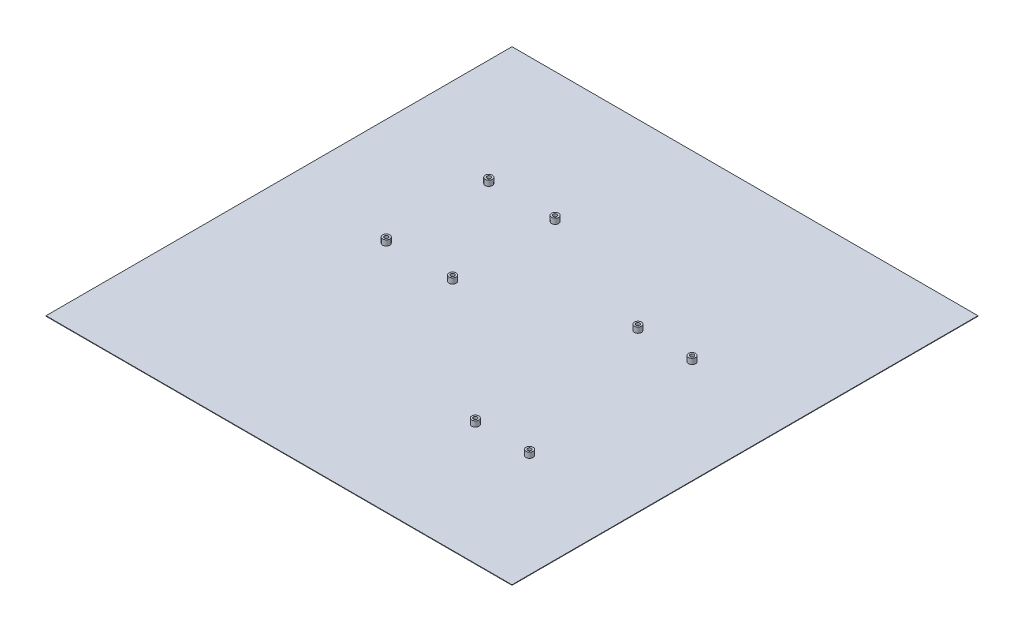
ISO-10303-21;
HEADER;
FILE_DESCRIPTION(('STEP AP214'),'2;1');
FILE_NAME('part.step','',(''),(''),'','','');
FILE_SCHEMA(('AUTOMOTIVE_DESIGN { 1 0 10303 214 1 1 1 1 }'));
ENDSEC;
DATA;
#1=APPLICATION_CONTEXT('core data for automotive mechanical design processes');
#2=APPLICATION_PROTOCOL_DEFINITION('international standard','automotive_design',2000,#1);
#3=PRODUCT_CONTEXT('',#1,'mechanical');
#4=PRODUCT('Part','Part','',(#3));
#5=PRODUCT_RELATED_PRODUCT_CATEGORY('part','',(#4));
#6=PRODUCT_DEFINITION_FORMATION('','',#4);
#7=PRODUCT_DEFINITION_CONTEXT('part definition',#1,'design');
#8=PRODUCT_DEFINITION('design','',#6,#7);
#9=PRODUCT_DEFINITION_SHAPE('','',#8);
#10=(LENGTH_UNIT() NAMED_UNIT(*) SI_UNIT(.MILLI.,.METRE.));
#11=(NAMED_UNIT(*) PLANE_ANGLE_UNIT() SI_UNIT($,.RADIAN.));
#12=(NAMED_UNIT(*) SI_UNIT($,.STERADIAN.) SOLID_ANGLE_UNIT());
#13=UNCERTAINTY_MEASURE_WITH_UNIT(LENGTH_MEASURE(1.E-05),#10,'distance_accuracy_value','');
#14=(GEOMETRIC_REPRESENTATION_CONTEXT(3) GLOBAL_UNCERTAINTY_ASSIGNED_CONTEXT((#13)) GLOBAL_UNIT_ASSIGNED_CONTEXT((#10,
#11,#12)) REPRESENTATION_CONTEXT('',''));
#15=CARTESIAN_POINT('',(0.,0.,0.));
#16=DIRECTION('',(0.,0.,1.));
#17=DIRECTION('',(1.,0.,0.));
#18=AXIS2_PLACEMENT_3D('',#15,#16,#17);
#19=CARTESIAN_POINT('',(215.,0.45,215.));
#20=DIRECTION('',(-1.,0.,0.));
#21=DIRECTION('',(0.,0.,1.));
#22=AXIS2_PLACEMENT_3D('',#19,#20,#21);
#23=PLANE('',#22);
#24=DIRECTION('',(0.,0.,-1.));
#25=VECTOR('',#24,1.);
#26=CARTESIAN_POINT('',(215.,0.,215.));
#27=LINE('',#26,#25);
#28=CARTESIAN_POINT('',(215.,0.,215.));
#29=VERTEX_POINT('',#28);
#30=CARTESIAN_POINT('',(215.,0.,-215.));
#31=VERTEX_POINT('',#30);
#32=EDGE_CURVE('E101',#29,#31,#27,.T.);
#33=ORIENTED_EDGE('',*,*,#32,.T.);
#34=DIRECTION('',(0.,-1.,0.));
#35=VECTOR('',#34,1.);
#36=CARTESIAN_POINT('',(215.,0.45,-215.));
#37=LINE('',#36,#35);
#38=CARTESIAN_POINT('',(215.,0.45,-215.));
#39=VERTEX_POINT('',#38);
#40=EDGE_CURVE('E92',#39,#31,#37,.T.);
#41=ORIENTED_EDGE('',*,*,#40,.F.);
#42=DIRECTION('',(0.,0.,-1.));
#43=VECTOR('',#42,1.);
#44=CARTESIAN_POINT('',(215.,0.45,215.));
#45=LINE('',#44,#43);
#46=CARTESIAN_POINT('',(215.,0.45,215.));
#47=VERTEX_POINT('',#46);
#48=EDGE_CURVE('E86',#47,#39,#45,.T.);
#49=ORIENTED_EDGE('',*,*,#48,.F.);
#50=DIRECTION('',(0.,-1.,0.));
#51=VECTOR('',#50,1.);
#52=CARTESIAN_POINT('',(215.,0.45,215.));
#53=LINE('',#52,#51);
#54=EDGE_CURVE('E97',#47,#29,#53,.T.);
#55=ORIENTED_EDGE('',*,*,#54,.T.);
#56=EDGE_LOOP('',(#33,#41,#49,#55));
#57=FACE_BOUND('',#56,.T.);
#58=ADVANCED_FACE('F34',(#57),#23,.F.);
#59=CARTESIAN_POINT('',(-215.,0.45,-215.));
#60=DIRECTION('',(0.,0.,1.));
#61=DIRECTION('',(1.,0.,0.));
#62=AXIS2_PLACEMENT_3D('',#59,#60,#61);
#63=PLANE('',#62);
#64=DIRECTION('',(-1.,0.,0.));
#65=VECTOR('',#64,1.);
#66=CARTESIAN_POINT('',(-215.,0.,-215.));
#67=LINE('',#66,#65);
#68=CARTESIAN_POINT('',(-215.,0.,-215.));
#69=VERTEX_POINT('',#68);
#70=EDGE_CURVE('E91',#31,#69,#67,.T.);
#71=ORIENTED_EDGE('',*,*,#70,.T.);
#72=DIRECTION('',(0.,-1.,0.));
#73=VECTOR('',#72,1.);
#74=CARTESIAN_POINT('',(-215.,0.45,-215.));
#75=LINE('',#74,#73);
#76=CARTESIAN_POINT('',(-215.,0.45,-215.));
#77=VERTEX_POINT('',#76);
#78=EDGE_CURVE('E89',#77,#69,#75,.T.);
#79=ORIENTED_EDGE('',*,*,#78,.F.);
#80=DIRECTION('',(-1.,0.,0.));
#81=VECTOR('',#80,1.);
#82=CARTESIAN_POINT('',(-215.,0.45,-215.));
#83=LINE('',#82,#81);
#84=EDGE_CURVE('E81',#39,#77,#83,.T.);
#85=ORIENTED_EDGE('',*,*,#84,.F.);
#86=ORIENTED_EDGE('',*,*,#40,.T.);
#87=EDGE_LOOP('',(#71,#79,#85,#86));
#88=FACE_BOUND('',#87,.T.);
#89=ADVANCED_FACE('F90',(#88),#63,.F.);
#90=CARTESIAN_POINT('',(-215.,0.45,215.));
#91=DIRECTION('',(1.,0.,0.));
#92=DIRECTION('',(0.,0.,-1.));
#93=AXIS2_PLACEMENT_3D('',#90,#91,#92);
#94=PLANE('',#93);
#95=DIRECTION('',(0.,0.,1.));
#96=VECTOR('',#95,1.);
#97=CARTESIAN_POINT('',(-215.,0.,215.));
#98=LINE('',#97,#96);
#99=CARTESIAN_POINT('',(-215.,0.,215.));
#100=VERTEX_POINT('',#99);
#101=EDGE_CURVE('E67',#69,#100,#98,.T.);
#102=ORIENTED_EDGE('',*,*,#101,.T.);
#103=DIRECTION('',(0.,-1.,0.));
#104=VECTOR('',#103,1.);
#105=CARTESIAN_POINT('',(-215.,0.45,215.));
#106=LINE('',#105,#104);
#107=CARTESIAN_POINT('',(-215.,0.45,215.));
#108=VERTEX_POINT('',#107);
#109=EDGE_CURVE('E93',#108,#100,#106,.T.);
#110=ORIENTED_EDGE('',*,*,#109,.F.);
#111=DIRECTION('',(0.,0.,1.));
#112=VECTOR('',#111,1.);
#113=CARTESIAN_POINT('',(-215.,0.45,215.));
#114=LINE('',#113,#112);
#115=EDGE_CURVE('E84',#77,#108,#114,.T.);
#116=ORIENTED_EDGE('',*,*,#115,.F.);
#117=ORIENTED_EDGE('',*,*,#78,.T.);
#118=EDGE_LOOP('',(#102,#110,#116,#117));
#119=FACE_BOUND('',#118,.T.);
#120=ADVANCED_FACE('F95',(#119),#94,.F.);
#121=CARTESIAN_POINT('',(-215.,0.45,215.));
#122=DIRECTION('',(0.,0.,-1.));
#123=DIRECTION('',(-1.,0.,0.));
#124=AXIS2_PLACEMENT_3D('',#121,#122,#123);
#125=PLANE('',#124);
#126=DIRECTION('',(1.,0.,0.));
#127=VECTOR('',#126,1.);
#128=CARTESIAN_POINT('',(-215.,0.,215.));
#129=LINE('',#128,#127);
#130=EDGE_CURVE('E73',#100,#29,#129,.T.);
#131=ORIENTED_EDGE('',*,*,#130,.T.);
#132=ORIENTED_EDGE('',*,*,#54,.F.);
#133=DIRECTION('',(1.,0.,0.));
#134=VECTOR('',#133,1.);
#135=CARTESIAN_POINT('',(-215.,0.45,215.));
#136=LINE('',#135,#134);
#137=EDGE_CURVE('E50',#108,#47,#136,.T.);
#138=ORIENTED_EDGE('',*,*,#137,.F.);
#139=ORIENTED_EDGE('',*,*,#109,.T.);
#140=EDGE_LOOP('',(#131,#132,#138,#139));
#141=FACE_BOUND('',#140,.T.);
#142=ADVANCED_FACE('F136',(#141),#125,.F.);
#143=CARTESIAN_POINT('',(0.,0.45,0.));
#144=DIRECTION('',(0.,-1.,0.));
#145=DIRECTION('',(0.,0.,-1.));
#146=AXIS2_PLACEMENT_3D('',#143,#144,#145);
#147=PLANE('',#146);
#148=CARTESIAN_POINT('',(69.7933457956039,0.45,103.62693864792));
#149=DIRECTION('',(0.,-1.,0.));
#150=DIRECTION('',(0.,0.,-1.));
#151=AXIS2_PLACEMENT_3D('',#148,#149,#150);
#152=CIRCLE('',#151,3.3);
#153=CARTESIAN_POINT('',(69.7933457956039,0.45,100.32693864792));
#154=VERTEX_POINT('',#153);
#155=EDGE_CURVE('E11',#154,#154,#152,.F.);
#156=ORIENTED_EDGE('',*,*,#155,.F.);
#157=EDGE_LOOP('',(#156));
#158=FACE_BOUND('',#157,.T.);
#159=CARTESIAN_POINT('',(119.793345795604,0.45,103.62693864792));
#160=DIRECTION('',(0.,-1.,0.));
#161=DIRECTION('',(0.,0.,-1.));
#162=AXIS2_PLACEMENT_3D('',#159,#160,#161);
#163=CIRCLE('',#162,3.3);
#164=CARTESIAN_POINT('',(119.793345795604,0.45,100.32693864792));
#165=VERTEX_POINT('',#164);
#166=EDGE_CURVE('E42',#165,#165,#163,.F.);
#167=ORIENTED_EDGE('',*,*,#166,.F.);
#168=EDGE_LOOP('',(#167));
#169=FACE_BOUND('',#168,.T.);
#170=CARTESIAN_POINT('',(69.7933457956034,0.45,-46.3730613520803));
#171=DIRECTION('',(0.,-1.,0.));
#172=DIRECTION('',(0.,0.,-1.));
#173=AXIS2_PLACEMENT_3D('',#170,#171,#172);
#174=CIRCLE('',#173,3.29999999999999);
#175=CARTESIAN_POINT('',(69.7933457956034,0.45,-49.6730613520803));
#176=VERTEX_POINT('',#175);
#177=EDGE_CURVE('E126',#176,#176,#174,.F.);
#178=ORIENTED_EDGE('',*,*,#177,.F.);
#179=EDGE_LOOP('',(#178));
#180=FACE_BOUND('',#179,.T.);
#181=CARTESIAN_POINT('',(119.793345795603,0.45,-46.3730613520804));
#182=DIRECTION('',(0.,-1.,0.));
#183=DIRECTION('',(0.,0.,-1.));
#184=AXIS2_PLACEMENT_3D('',#181,#182,#183);
#185=CIRCLE('',#184,3.3);
#186=CARTESIAN_POINT('',(119.793345795603,0.45,-49.6730613520804));
#187=VERTEX_POINT('',#186);
#188=EDGE_CURVE('E123',#187,#187,#185,.F.);
#189=ORIENTED_EDGE('',*,*,#188,.F.);
#190=EDGE_LOOP('',(#189));
#191=FACE_BOUND('',#190,.T.);
#192=CARTESIAN_POINT('',(-115.979958459858,0.45,0.0533736116027292));
#193=DIRECTION('',(0.,-1.,0.));
#194=DIRECTION('',(0.,0.,-1.));
#195=AXIS2_PLACEMENT_3D('',#192,#193,#194);
#196=CIRCLE('',#195,3.3);
#197=CARTESIAN_POINT('',(-115.979958459858,0.45,-3.24662638839728));
#198=VERTEX_POINT('',#197);
#199=EDGE_CURVE('E120',#198,#198,#196,.F.);
#200=ORIENTED_EDGE('',*,*,#199,.F.);
#201=EDGE_LOOP('',(#200));
#202=FACE_BOUND('',#201,.T.);
#203=CARTESIAN_POINT('',(-54.9804485661854,0.45,-0.19239606062272));
#204=DIRECTION('',(0.,-1.,0.));
#205=DIRECTION('',(0.,0.,-1.));
#206=AXIS2_PLACEMENT_3D('',#203,#204,#205);
#207=CIRCLE('',#206,3.3);
#208=CARTESIAN_POINT('',(-54.9804485661854,0.45,-3.49239606062272));
#209=VERTEX_POINT('',#208);
#210=EDGE_CURVE('E117',#209,#209,#207,.F.);
#211=ORIENTED_EDGE('',*,*,#210,.F.);
#212=EDGE_LOOP('',(#211));
#213=FACE_BOUND('',#212,.T.);
#214=CARTESIAN_POINT('',(-55.3632046349034,0.45,-95.1916381933473));
#215=DIRECTION('',(0.,-1.,0.));
#216=DIRECTION('',(0.,0.,-1.));
#217=AXIS2_PLACEMENT_3D('',#214,#215,#216);
#218=CIRCLE('',#217,3.3);
#219=CARTESIAN_POINT('',(-55.3632046349034,0.45,-98.4916381933473));
#220=VERTEX_POINT('',#219);
#221=EDGE_CURVE('E114',#220,#220,#218,.F.);
#222=ORIENTED_EDGE('',*,*,#221,.F.);
#223=EDGE_LOOP('',(#222));
#224=FACE_BOUND('',#223,.T.);
#225=CARTESIAN_POINT('',(-116.362714528576,0.45,-94.9458685211219));
#226=DIRECTION('',(0.,-1.,0.));
#227=DIRECTION('',(0.,0.,-1.));
#228=AXIS2_PLACEMENT_3D('',#225,#226,#227);
#229=CIRCLE('',#228,3.3);
#230=CARTESIAN_POINT('',(-116.362714528576,0.45,-98.2458685211218));
#231=VERTEX_POINT('',#230);
#232=EDGE_CURVE('E111',#231,#231,#229,.F.);
#233=ORIENTED_EDGE('',*,*,#232,.F.);
#234=EDGE_LOOP('',(#233));
#235=FACE_BOUND('',#234,.T.);
#236=ORIENTED_EDGE('',*,*,#48,.T.);
#237=ORIENTED_EDGE('',*,*,#84,.T.);
#238=ORIENTED_EDGE('',*,*,#115,.T.);
#239=ORIENTED_EDGE('',*,*,#137,.T.);
#240=EDGE_LOOP('',(#236,#237,#238,#239));
#241=FACE_BOUND('',#240,.T.);
#242=ADVANCED_FACE('F82',(#158,#169,#180,#191,#202,#213,#224,#235,#241),#147,.F.);
#243=CARTESIAN_POINT('',(0.,0.,0.));
#244=DIRECTION('',(0.,-1.,0.));
#245=DIRECTION('',(0.,0.,-1.));
#246=AXIS2_PLACEMENT_3D('',#243,#244,#245);
#247=PLANE('',#246);
#248=ORIENTED_EDGE('',*,*,#32,.F.);
#249=ORIENTED_EDGE('',*,*,#130,.F.);
#250=ORIENTED_EDGE('',*,*,#101,.F.);
#251=ORIENTED_EDGE('',*,*,#70,.F.);
#252=EDGE_LOOP('',(#248,#249,#250,#251));
#253=FACE_BOUND('',#252,.T.);
#254=ADVANCED_FACE('F135',(#253),#247,.T.);
#255=CARTESIAN_POINT('',(-116.362714528576,5.45,-94.9458685211219));
#256=DIRECTION('',(0.,-1.,0.));
#257=DIRECTION('',(0.,0.,-1.));
#258=AXIS2_PLACEMENT_3D('',#255,#256,#257);
#259=CYLINDRICAL_SURFACE('',#258,3.3);
#260=CARTESIAN_POINT('',(-116.362714528576,5.45,-94.9458685211219));
#261=DIRECTION('',(0.,1.,0.));
#262=DIRECTION('',(0.,0.,1.));
#263=AXIS2_PLACEMENT_3D('',#260,#261,#262);
#264=CIRCLE('',#263,3.3);
#265=CARTESIAN_POINT('',(-116.362714528576,5.45,-91.6458685211219));
#266=VERTEX_POINT('',#265);
#267=EDGE_CURVE('E104',#266,#266,#264,.T.);
#268=ORIENTED_EDGE('',*,*,#267,.F.);
#269=EDGE_LOOP('',(#268));
#270=FACE_BOUND('',#269,.T.);
#271=ORIENTED_EDGE('',*,*,#232,.T.);
#272=EDGE_LOOP('',(#271));
#273=FACE_BOUND('',#272,.T.);
#274=ADVANCED_FACE('F151',(#270,#273),#259,.T.);
#275=CARTESIAN_POINT('',(-116.362714528576,5.45,-94.9458685211219));
#276=DIRECTION('',(0.,1.,0.));
#277=DIRECTION('',(0.,0.,1.));
#278=AXIS2_PLACEMENT_3D('',#275,#276,#277);
#279=PLANE('',#278);
#280=CARTESIAN_POINT('',(-116.362714528576,5.45,-94.9458685211219));
#281=DIRECTION('',(0.,1.,0.));
#282=DIRECTION('',(0.,0.,1.));
#283=AXIS2_PLACEMENT_3D('',#280,#281,#282);
#284=CIRCLE('',#283,1.75);
#285=CARTESIAN_POINT('',(-116.362714528576,5.45,-93.1958685211219));
#286=VERTEX_POINT('',#285);
#287=EDGE_CURVE('E565',#286,#286,#284,.T.);
#288=ORIENTED_EDGE('',*,*,#287,.F.);
#289=EDGE_LOOP('',(#288));
#290=FACE_BOUND('',#289,.T.);
#291=ORIENTED_EDGE('',*,*,#267,.T.);
#292=EDGE_LOOP('',(#291));
#293=FACE_BOUND('',#292,.T.);
#294=ADVANCED_FACE('F153',(#290,#293),#279,.T.);
#295=CARTESIAN_POINT('',(-55.3632046349034,5.45,-95.1916381933473));
#296=DIRECTION('',(0.,-1.,0.));
#297=DIRECTION('',(0.,0.,-1.));
#298=AXIS2_PLACEMENT_3D('',#295,#296,#297);
#299=CYLINDRICAL_SURFACE('',#298,3.3);
#300=CARTESIAN_POINT('',(-55.3632046349034,5.45,-95.1916381933473));
#301=DIRECTION('',(0.,1.,0.));
#302=DIRECTION('',(0.,0.,1.));
#303=AXIS2_PLACEMENT_3D('',#300,#301,#302);
#304=CIRCLE('',#303,3.3);
#305=CARTESIAN_POINT('',(-55.3632046349034,5.45,-91.8916381933473));
#306=VERTEX_POINT('',#305);
#307=EDGE_CURVE('E584',#306,#306,#304,.T.);
#308=ORIENTED_EDGE('',*,*,#307,.F.);
#309=EDGE_LOOP('',(#308));
#310=FACE_BOUND('',#309,.T.);
#311=ORIENTED_EDGE('',*,*,#221,.T.);
#312=EDGE_LOOP('',(#311));
#313=FACE_BOUND('',#312,.T.);
#314=ADVANCED_FACE('F160',(#310,#313),#299,.T.);
#315=CARTESIAN_POINT('',(-55.3632046349034,5.45,-95.1916381933473));
#316=DIRECTION('',(0.,1.,0.));
#317=DIRECTION('',(0.,0.,1.));
#318=AXIS2_PLACEMENT_3D('',#315,#316,#317);
#319=PLANE('',#318);
#320=CARTESIAN_POINT('',(-55.3632046349034,5.45,-95.1916381933473));
#321=DIRECTION('',(0.,1.,0.));
#322=DIRECTION('',(0.,0.,1.));
#323=AXIS2_PLACEMENT_3D('',#320,#321,#322);
#324=CIRCLE('',#323,1.75);
#325=CARTESIAN_POINT('',(-55.3632046349034,5.45,-93.4416381933473));
#326=VERTEX_POINT('',#325);
#327=EDGE_CURVE('E559',#326,#326,#324,.T.);
#328=ORIENTED_EDGE('',*,*,#327,.F.);
#329=EDGE_LOOP('',(#328));
#330=FACE_BOUND('',#329,.T.);
#331=ORIENTED_EDGE('',*,*,#307,.T.);
#332=EDGE_LOOP('',(#331));
#333=FACE_BOUND('',#332,.T.);
#334=ADVANCED_FACE('F227',(#330,#333),#319,.T.);
#335=CARTESIAN_POINT('',(-54.9804485661854,5.45,-0.19239606062272));
#336=DIRECTION('',(0.,-1.,0.));
#337=DIRECTION('',(0.,0.,-1.));
#338=AXIS2_PLACEMENT_3D('',#335,#336,#337);
#339=CYLINDRICAL_SURFACE('',#338,3.3);
#340=CARTESIAN_POINT('',(-54.9804485661854,5.45,-0.19239606062272));
#341=DIRECTION('',(0.,1.,0.));
#342=DIRECTION('',(0.,0.,1.));
#343=AXIS2_PLACEMENT_3D('',#340,#341,#342);
#344=CIRCLE('',#343,3.3);
#345=CARTESIAN_POINT('',(-54.9804485661854,5.45,3.10760393937728));
#346=VERTEX_POINT('',#345);
#347=EDGE_CURVE('E581',#346,#346,#344,.T.);
#348=ORIENTED_EDGE('',*,*,#347,.F.);
#349=EDGE_LOOP('',(#348));
#350=FACE_BOUND('',#349,.T.);
#351=ORIENTED_EDGE('',*,*,#210,.T.);
#352=EDGE_LOOP('',(#351));
#353=FACE_BOUND('',#352,.T.);
#354=ADVANCED_FACE('F236',(#350,#353),#339,.T.);
#355=CARTESIAN_POINT('',(-54.9804485661854,5.45,-0.19239606062272));
#356=DIRECTION('',(0.,1.,0.));
#357=DIRECTION('',(0.,0.,1.));
#358=AXIS2_PLACEMENT_3D('',#355,#356,#357);
#359=PLANE('',#358);
#360=CARTESIAN_POINT('',(-54.9804485661854,5.45,-0.19239606062272));
#361=DIRECTION('',(0.,1.,0.));
#362=DIRECTION('',(0.,0.,1.));
#363=AXIS2_PLACEMENT_3D('',#360,#361,#362);
#364=CIRCLE('',#363,1.75);
#365=CARTESIAN_POINT('',(-54.9804485661854,5.45,1.55760393937728));
#366=VERTEX_POINT('',#365);
#367=EDGE_CURVE('E558',#366,#366,#364,.T.);
#368=ORIENTED_EDGE('',*,*,#367,.F.);
#369=EDGE_LOOP('',(#368));
#370=FACE_BOUND('',#369,.T.);
#371=ORIENTED_EDGE('',*,*,#347,.T.);
#372=EDGE_LOOP('',(#371));
#373=FACE_BOUND('',#372,.T.);
#374=ADVANCED_FACE('F245',(#370,#373),#359,.T.);
#375=CARTESIAN_POINT('',(-115.979958459858,5.45,0.0533736116027292));
#376=DIRECTION('',(0.,-1.,0.));
#377=DIRECTION('',(0.,0.,-1.));
#378=AXIS2_PLACEMENT_3D('',#375,#376,#377);
#379=CYLINDRICAL_SURFACE('',#378,3.3);
#380=CARTESIAN_POINT('',(-115.979958459858,5.45,0.0533736116027292));
#381=DIRECTION('',(0.,1.,0.));
#382=DIRECTION('',(0.,0.,1.));
#383=AXIS2_PLACEMENT_3D('',#380,#381,#382);
#384=CIRCLE('',#383,3.3);
#385=CARTESIAN_POINT('',(-115.979958459858,5.45,3.35337361160273));
#386=VERTEX_POINT('',#385);
#387=EDGE_CURVE('E576',#386,#386,#384,.T.);
#388=ORIENTED_EDGE('',*,*,#387,.F.);
#389=EDGE_LOOP('',(#388));
#390=FACE_BOUND('',#389,.T.);
#391=ORIENTED_EDGE('',*,*,#199,.T.);
#392=EDGE_LOOP('',(#391));
#393=FACE_BOUND('',#392,.T.);
#394=ADVANCED_FACE('F253',(#390,#393),#379,.T.);
#395=CARTESIAN_POINT('',(-115.979958459858,5.45,0.0533736116027292));
#396=DIRECTION('',(0.,1.,0.));
#397=DIRECTION('',(0.,0.,1.));
#398=AXIS2_PLACEMENT_3D('',#395,#396,#397);
#399=PLANE('',#398);
#400=CARTESIAN_POINT('',(-115.979958459858,5.45,0.0533736116027292));
#401=DIRECTION('',(0.,1.,0.));
#402=DIRECTION('',(0.,0.,1.));
#403=AXIS2_PLACEMENT_3D('',#400,#401,#402);
#404=CIRCLE('',#403,1.75);
#405=CARTESIAN_POINT('',(-115.979958459858,5.45,1.80337361160273));
#406=VERTEX_POINT('',#405);
#407=EDGE_CURVE('E554',#406,#406,#404,.T.);
#408=ORIENTED_EDGE('',*,*,#407,.F.);
#409=EDGE_LOOP('',(#408));
#410=FACE_BOUND('',#409,.T.);
#411=ORIENTED_EDGE('',*,*,#387,.T.);
#412=EDGE_LOOP('',(#411));
#413=FACE_BOUND('',#412,.T.);
#414=ADVANCED_FACE('F262',(#410,#413),#399,.T.);
#415=CARTESIAN_POINT('',(-115.979958459858,1.45,0.0533736116027292));
#416=DIRECTION('',(0.,1.,0.));
#417=DIRECTION('',(0.,0.,1.));
#418=AXIS2_PLACEMENT_3D('',#415,#416,#417);
#419=CYLINDRICAL_SURFACE('',#418,1.75);
#420=CARTESIAN_POINT('',(-115.979958459858,1.45,0.0533736116027292));
#421=DIRECTION('',(0.,1.,0.));
#422=DIRECTION('',(0.,0.,1.));
#423=AXIS2_PLACEMENT_3D('',#420,#421,#422);
#424=CIRCLE('',#423,1.75);
#425=CARTESIAN_POINT('',(-115.979958459858,1.45,1.80337361160273));
#426=VERTEX_POINT('',#425);
#427=EDGE_CURVE('E568',#426,#426,#424,.T.);
#428=ORIENTED_EDGE('',*,*,#427,.F.);
#429=EDGE_LOOP('',(#428));
#430=FACE_BOUND('',#429,.T.);
#431=ORIENTED_EDGE('',*,*,#407,.T.);
#432=EDGE_LOOP('',(#431));
#433=FACE_BOUND('',#432,.T.);
#434=ADVANCED_FACE('F270',(#430,#433),#419,.F.);
#435=CARTESIAN_POINT('',(-115.979958459858,1.45,0.0533736116027292));
#436=DIRECTION('',(0.,1.,0.));
#437=DIRECTION('',(0.,0.,1.));
#438=AXIS2_PLACEMENT_3D('',#435,#436,#437);
#439=PLANE('',#438);
#440=ORIENTED_EDGE('',*,*,#427,.T.);
#441=EDGE_LOOP('',(#440));
#442=FACE_BOUND('',#441,.T.);
#443=ADVANCED_FACE('F279',(#442),#439,.T.);
#444=CARTESIAN_POINT('',(-54.9804485661854,1.45,-0.19239606062272));
#445=DIRECTION('',(0.,1.,0.));
#446=DIRECTION('',(0.,0.,1.));
#447=AXIS2_PLACEMENT_3D('',#444,#445,#446);
#448=CYLINDRICAL_SURFACE('',#447,1.75);
#449=CARTESIAN_POINT('',(-54.9804485661854,1.45,-0.19239606062272));
#450=DIRECTION('',(0.,1.,0.));
#451=DIRECTION('',(0.,0.,1.));
#452=AXIS2_PLACEMENT_3D('',#449,#450,#451);
#453=CIRCLE('',#452,1.75);
#454=CARTESIAN_POINT('',(-54.9804485661854,1.45,1.55760393937728));
#455=VERTEX_POINT('',#454);
#456=EDGE_CURVE('E573',#455,#455,#453,.T.);
#457=ORIENTED_EDGE('',*,*,#456,.F.);
#458=EDGE_LOOP('',(#457));
#459=FACE_BOUND('',#458,.T.);
#460=ORIENTED_EDGE('',*,*,#367,.T.);
#461=EDGE_LOOP('',(#460));
#462=FACE_BOUND('',#461,.T.);
#463=ADVANCED_FACE('F288',(#459,#462),#448,.F.);
#464=CARTESIAN_POINT('',(-54.9804485661854,1.45,-0.19239606062272));
#465=DIRECTION('',(0.,1.,0.));
#466=DIRECTION('',(0.,0.,1.));
#467=AXIS2_PLACEMENT_3D('',#464,#465,#466);
#468=PLANE('',#467);
#469=ORIENTED_EDGE('',*,*,#456,.T.);
#470=EDGE_LOOP('',(#469));
#471=FACE_BOUND('',#470,.T.);
#472=ADVANCED_FACE('F297',(#471),#468,.T.);
#473=CARTESIAN_POINT('',(-55.3632046349034,1.45,-95.1916381933473));
#474=DIRECTION('',(0.,1.,0.));
#475=DIRECTION('',(0.,0.,1.));
#476=AXIS2_PLACEMENT_3D('',#473,#474,#475);
#477=CYLINDRICAL_SURFACE('',#476,1.75);
#478=CARTESIAN_POINT('',(-55.3632046349034,1.45,-95.1916381933473));
#479=DIRECTION('',(0.,1.,0.));
#480=DIRECTION('',(0.,0.,1.));
#481=AXIS2_PLACEMENT_3D('',#478,#479,#480);
#482=CIRCLE('',#481,1.75);
#483=CARTESIAN_POINT('',(-55.3632046349034,1.45,-93.4416381933473));
#484=VERTEX_POINT('',#483);
#485=EDGE_CURVE('E555',#484,#484,#482,.T.);
#486=ORIENTED_EDGE('',*,*,#485,.F.);
#487=EDGE_LOOP('',(#486));
#488=FACE_BOUND('',#487,.T.);
#489=ORIENTED_EDGE('',*,*,#327,.T.);
#490=EDGE_LOOP('',(#489));
#491=FACE_BOUND('',#490,.T.);
#492=ADVANCED_FACE('F306',(#488,#491),#477,.F.);
#493=CARTESIAN_POINT('',(-55.3632046349034,1.45,-95.1916381933473));
#494=DIRECTION('',(0.,1.,0.));
#495=DIRECTION('',(0.,0.,1.));
#496=AXIS2_PLACEMENT_3D('',#493,#494,#495);
#497=PLANE('',#496);
#498=ORIENTED_EDGE('',*,*,#485,.T.);
#499=EDGE_LOOP('',(#498));
#500=FACE_BOUND('',#499,.T.);
#501=ADVANCED_FACE('F315',(#500),#497,.T.);
#502=CARTESIAN_POINT('',(-116.362714528576,1.45,-94.9458685211219));
#503=DIRECTION('',(0.,1.,0.));
#504=DIRECTION('',(0.,0.,1.));
#505=AXIS2_PLACEMENT_3D('',#502,#503,#504);
#506=CYLINDRICAL_SURFACE('',#505,1.75);
#507=CARTESIAN_POINT('',(-116.362714528576,1.45,-94.9458685211219));
#508=DIRECTION('',(0.,1.,0.));
#509=DIRECTION('',(0.,0.,1.));
#510=AXIS2_PLACEMENT_3D('',#507,#508,#509);
#511=CIRCLE('',#510,1.75);
#512=CARTESIAN_POINT('',(-116.362714528576,1.45,-93.1958685211219));
#513=VERTEX_POINT('',#512);
#514=EDGE_CURVE('E562',#513,#513,#511,.T.);
#515=ORIENTED_EDGE('',*,*,#514,.F.);
#516=EDGE_LOOP('',(#515));
#517=FACE_BOUND('',#516,.T.);
#518=ORIENTED_EDGE('',*,*,#287,.T.);
#519=EDGE_LOOP('',(#518));
#520=FACE_BOUND('',#519,.T.);
#521=ADVANCED_FACE('F324',(#517,#520),#506,.F.);
#522=CARTESIAN_POINT('',(-116.362714528576,1.45,-94.9458685211219));
#523=DIRECTION('',(0.,1.,0.));
#524=DIRECTION('',(0.,0.,1.));
#525=AXIS2_PLACEMENT_3D('',#522,#523,#524);
#526=PLANE('',#525);
#527=ORIENTED_EDGE('',*,*,#514,.T.);
#528=EDGE_LOOP('',(#527));
#529=FACE_BOUND('',#528,.T.);
#530=ADVANCED_FACE('F333',(#529),#526,.T.);
#531=CARTESIAN_POINT('',(119.793345795603,5.45,-46.3730613520804));
#532=DIRECTION('',(0.,-1.,0.));
#533=DIRECTION('',(0.,0.,-1.));
#534=AXIS2_PLACEMENT_3D('',#531,#532,#533);
#535=CYLINDRICAL_SURFACE('',#534,3.3);
#536=CARTESIAN_POINT('',(119.793345795603,5.45,-46.3730613520804));
#537=DIRECTION('',(0.,1.,0.));
#538=DIRECTION('',(0.,0.,1.));
#539=AXIS2_PLACEMENT_3D('',#536,#537,#538);
#540=CIRCLE('',#539,3.3);
#541=CARTESIAN_POINT('',(119.793345795603,5.45,-43.0730613520804));
#542=VERTEX_POINT('',#541);
#543=EDGE_CURVE('E551',#542,#542,#540,.T.);
#544=ORIENTED_EDGE('',*,*,#543,.F.);
#545=EDGE_LOOP('',(#544));
#546=FACE_BOUND('',#545,.T.);
#547=ORIENTED_EDGE('',*,*,#188,.T.);
#548=EDGE_LOOP('',(#547));
#549=FACE_BOUND('',#548,.T.);
#550=ADVANCED_FACE('F341',(#546,#549),#535,.T.);
#551=CARTESIAN_POINT('',(119.793345795603,5.45,-46.3730613520804));
#552=DIRECTION('',(0.,1.,0.));
#553=DIRECTION('',(0.,0.,1.));
#554=AXIS2_PLACEMENT_3D('',#551,#552,#553);
#555=PLANE('',#554);
#556=CARTESIAN_POINT('',(119.793345795603,5.45,-46.3730613520804));
#557=DIRECTION('',(0.,1.,0.));
#558=DIRECTION('',(0.,0.,1.));
#559=AXIS2_PLACEMENT_3D('',#556,#557,#558);
#560=CIRCLE('',#559,1.75);
#561=CARTESIAN_POINT('',(119.793345795603,5.45,-44.6230613520804));
#562=VERTEX_POINT('',#561);
#563=EDGE_CURVE('E520',#562,#562,#560,.T.);
#564=ORIENTED_EDGE('',*,*,#563,.F.);
#565=EDGE_LOOP('',(#564));
#566=FACE_BOUND('',#565,.T.);
#567=ORIENTED_EDGE('',*,*,#543,.T.);
#568=EDGE_LOOP('',(#567));
#569=FACE_BOUND('',#568,.T.);
#570=ADVANCED_FACE('F349',(#566,#569),#555,.T.);
#571=CARTESIAN_POINT('',(69.7933457956034,5.45,-46.3730613520803));
#572=DIRECTION('',(0.,-1.,0.));
#573=DIRECTION('',(0.,0.,-1.));
#574=AXIS2_PLACEMENT_3D('',#571,#572,#573);
#575=CYLINDRICAL_SURFACE('',#574,3.29999999999999);
#576=CARTESIAN_POINT('',(69.7933457956034,5.45,-46.3730613520803));
#577=DIRECTION('',(0.,1.,0.));
#578=DIRECTION('',(0.,0.,1.));
#579=AXIS2_PLACEMENT_3D('',#576,#577,#578);
#580=CIRCLE('',#579,3.29999999999999);
#581=CARTESIAN_POINT('',(69.7933457956034,5.45,-43.0730613520803));
#582=VERTEX_POINT('',#581);
#583=EDGE_CURVE('E548',#582,#582,#580,.T.);
#584=ORIENTED_EDGE('',*,*,#583,.F.);
#585=EDGE_LOOP('',(#584));
#586=FACE_BOUND('',#585,.T.);
#587=ORIENTED_EDGE('',*,*,#177,.T.);
#588=EDGE_LOOP('',(#587));
#589=FACE_BOUND('',#588,.T.);
#590=ADVANCED_FACE('F359',(#586,#589),#575,.T.);
#591=CARTESIAN_POINT('',(69.7933457956034,5.45,-46.3730613520803));
#592=DIRECTION('',(0.,1.,0.));
#593=DIRECTION('',(0.,0.,1.));
#594=AXIS2_PLACEMENT_3D('',#591,#592,#593);
#595=PLANE('',#594);
#596=CARTESIAN_POINT('',(69.7933457956034,5.45,-46.3730613520803));
#597=DIRECTION('',(0.,1.,0.));
#598=DIRECTION('',(0.,0.,1.));
#599=AXIS2_PLACEMENT_3D('',#596,#597,#598);
#600=CIRCLE('',#599,1.75);
#601=CARTESIAN_POINT('',(69.7933457956034,5.45,-44.6230613520803));
#602=VERTEX_POINT('',#601);
#603=EDGE_CURVE('E519',#602,#602,#600,.T.);
#604=ORIENTED_EDGE('',*,*,#603,.F.);
#605=EDGE_LOOP('',(#604));
#606=FACE_BOUND('',#605,.T.);
#607=ORIENTED_EDGE('',*,*,#583,.T.);
#608=EDGE_LOOP('',(#607));
#609=FACE_BOUND('',#608,.T.);
#610=ADVANCED_FACE('F369',(#606,#609),#595,.T.);
#611=CARTESIAN_POINT('',(119.793345795604,5.45,103.62693864792));
#612=DIRECTION('',(0.,-1.,0.));
#613=DIRECTION('',(0.,0.,-1.));
#614=AXIS2_PLACEMENT_3D('',#611,#612,#613);
#615=CYLINDRICAL_SURFACE('',#614,3.3);
#616=CARTESIAN_POINT('',(119.793345795604,5.45,103.62693864792));
#617=DIRECTION('',(0.,1.,0.));
#618=DIRECTION('',(0.,0.,1.));
#619=AXIS2_PLACEMENT_3D('',#616,#617,#618);
#620=CIRCLE('',#619,3.3);
#621=CARTESIAN_POINT('',(119.793345795604,5.45,106.92693864792));
#622=VERTEX_POINT('',#621);
#623=EDGE_CURVE('E545',#622,#622,#620,.T.);
#624=ORIENTED_EDGE('',*,*,#623,.F.);
#625=EDGE_LOOP('',(#624));
#626=FACE_BOUND('',#625,.T.);
#627=ORIENTED_EDGE('',*,*,#166,.T.);
#628=EDGE_LOOP('',(#627));
#629=FACE_BOUND('',#628,.T.);
#630=ADVANCED_FACE('F131',(#626,#629),#615,.T.);
#631=CARTESIAN_POINT('',(119.793345795604,5.45,103.62693864792));
#632=DIRECTION('',(0.,1.,0.));
#633=DIRECTION('',(0.,0.,1.));
#634=AXIS2_PLACEMENT_3D('',#631,#632,#633);
#635=PLANE('',#634);
#636=CARTESIAN_POINT('',(119.793345795604,5.45,103.62693864792));
#637=DIRECTION('',(0.,1.,0.));
#638=DIRECTION('',(0.,0.,1.));
#639=AXIS2_PLACEMENT_3D('',#636,#637,#638);
#640=CIRCLE('',#639,1.75);
#641=CARTESIAN_POINT('',(119.793345795604,5.45,105.37693864792));
#642=VERTEX_POINT('',#641);
#643=EDGE_CURVE('E531',#642,#642,#640,.T.);
#644=ORIENTED_EDGE('',*,*,#643,.F.);
#645=EDGE_LOOP('',(#644));
#646=FACE_BOUND('',#645,.T.);
#647=ORIENTED_EDGE('',*,*,#623,.T.);
#648=EDGE_LOOP('',(#647));
#649=FACE_BOUND('',#648,.T.);
#650=ADVANCED_FACE('F386',(#646,#649),#635,.T.);
#651=CARTESIAN_POINT('',(69.7933457956039,5.45,103.62693864792));
#652=DIRECTION('',(0.,-1.,0.));
#653=DIRECTION('',(0.,0.,-1.));
#654=AXIS2_PLACEMENT_3D('',#651,#652,#653);
#655=CYLINDRICAL_SURFACE('',#654,3.3);
#656=CARTESIAN_POINT('',(69.7933457956039,5.45,103.62693864792));
#657=DIRECTION('',(0.,1.,0.));
#658=DIRECTION('',(0.,0.,1.));
#659=AXIS2_PLACEMENT_3D('',#656,#657,#658);
#660=CIRCLE('',#659,3.3);
#661=CARTESIAN_POINT('',(69.7933457956039,5.45,106.92693864792));
#662=VERTEX_POINT('',#661);
#663=EDGE_CURVE('E541',#662,#662,#660,.T.);
#664=ORIENTED_EDGE('',*,*,#663,.F.);
#665=EDGE_LOOP('',(#664));
#666=FACE_BOUND('',#665,.T.);
#667=ORIENTED_EDGE('',*,*,#155,.T.);
#668=EDGE_LOOP('',(#667));
#669=FACE_BOUND('',#668,.T.);
#670=ADVANCED_FACE('F394',(#666,#669),#655,.T.);
#671=CARTESIAN_POINT('',(69.7933457956039,5.45,103.62693864792));
#672=DIRECTION('',(0.,1.,0.));
#673=DIRECTION('',(0.,0.,1.));
#674=AXIS2_PLACEMENT_3D('',#671,#672,#673);
#675=PLANE('',#674);
#676=CARTESIAN_POINT('',(69.7933457956039,5.45,103.62693864792));
#677=DIRECTION('',(0.,1.,0.));
#678=DIRECTION('',(0.,0.,1.));
#679=AXIS2_PLACEMENT_3D('',#676,#677,#678);
#680=CIRCLE('',#679,1.75);
#681=CARTESIAN_POINT('',(69.7933457956039,5.45,105.37693864792));
#682=VERTEX_POINT('',#681);
#683=EDGE_CURVE('E537',#682,#682,#680,.T.);
#684=ORIENTED_EDGE('',*,*,#683,.F.);
#685=EDGE_LOOP('',(#684));
#686=FACE_BOUND('',#685,.T.);
#687=ORIENTED_EDGE('',*,*,#663,.T.);
#688=EDGE_LOOP('',(#687));
#689=FACE_BOUND('',#688,.T.);
#690=ADVANCED_FACE('F403',(#686,#689),#675,.T.);
#691=CARTESIAN_POINT('',(69.7933457956039,1.45,103.62693864792));
#692=DIRECTION('',(0.,1.,0.));
#693=DIRECTION('',(0.,0.,1.));
#694=AXIS2_PLACEMENT_3D('',#691,#692,#693);
#695=CYLINDRICAL_SURFACE('',#694,1.75);
#696=CARTESIAN_POINT('',(69.7933457956039,1.45,103.62693864792));
#697=DIRECTION('',(0.,1.,0.));
#698=DIRECTION('',(0.,0.,1.));
#699=AXIS2_PLACEMENT_3D('',#696,#697,#698);
#700=CIRCLE('',#699,1.75);
#701=CARTESIAN_POINT('',(69.7933457956039,1.45,105.37693864792));
#702=VERTEX_POINT('',#701);
#703=EDGE_CURVE('E534',#702,#702,#700,.T.);
#704=ORIENTED_EDGE('',*,*,#703,.F.);
#705=EDGE_LOOP('',(#704));
#706=FACE_BOUND('',#705,.T.);
#707=ORIENTED_EDGE('',*,*,#683,.T.);
#708=EDGE_LOOP('',(#707));
#709=FACE_BOUND('',#708,.T.);
#710=ADVANCED_FACE('F411',(#706,#709),#695,.F.);
#711=CARTESIAN_POINT('',(69.7933457956039,1.45,103.62693864792));
#712=DIRECTION('',(0.,1.,0.));
#713=DIRECTION('',(0.,0.,1.));
#714=AXIS2_PLACEMENT_3D('',#711,#712,#713);
#715=PLANE('',#714);
#716=ORIENTED_EDGE('',*,*,#703,.T.);
#717=EDGE_LOOP('',(#716));
#718=FACE_BOUND('',#717,.T.);
#719=ADVANCED_FACE('F420',(#718),#715,.T.);
#720=CARTESIAN_POINT('',(119.793345795604,1.45,103.62693864792));
#721=DIRECTION('',(0.,1.,0.));
#722=DIRECTION('',(0.,0.,1.));
#723=AXIS2_PLACEMENT_3D('',#720,#721,#722);
#724=CYLINDRICAL_SURFACE('',#723,1.75);
#725=CARTESIAN_POINT('',(119.793345795604,1.45,103.62693864792));
#726=DIRECTION('',(0.,1.,0.));
#727=DIRECTION('',(0.,0.,1.));
#728=AXIS2_PLACEMENT_3D('',#725,#726,#727);
#729=CIRCLE('',#728,1.75);
#730=CARTESIAN_POINT('',(119.793345795604,1.45,105.37693864792));
#731=VERTEX_POINT('',#730);
#732=EDGE_CURVE('E526',#731,#731,#729,.T.);
#733=ORIENTED_EDGE('',*,*,#732,.F.);
#734=EDGE_LOOP('',(#733));
#735=FACE_BOUND('',#734,.T.);
#736=ORIENTED_EDGE('',*,*,#643,.T.);
#737=EDGE_LOOP('',(#736));
#738=FACE_BOUND('',#737,.T.);
#739=ADVANCED_FACE('F429',(#735,#738),#724,.F.);
#740=CARTESIAN_POINT('',(119.793345795604,1.45,103.62693864792));
#741=DIRECTION('',(0.,1.,0.));
#742=DIRECTION('',(0.,0.,1.));
#743=AXIS2_PLACEMENT_3D('',#740,#741,#742);
#744=PLANE('',#743);
#745=ORIENTED_EDGE('',*,*,#732,.T.);
#746=EDGE_LOOP('',(#745));
#747=FACE_BOUND('',#746,.T.);
#748=ADVANCED_FACE('F438',(#747),#744,.T.);
#749=CARTESIAN_POINT('',(69.7933457956034,1.45,-46.3730613520803));
#750=DIRECTION('',(0.,1.,0.));
#751=DIRECTION('',(0.,0.,1.));
#752=AXIS2_PLACEMENT_3D('',#749,#750,#751);
#753=CYLINDRICAL_SURFACE('',#752,1.75);
#754=CARTESIAN_POINT('',(69.7933457956034,1.45,-46.3730613520803));
#755=DIRECTION('',(0.,1.,0.));
#756=DIRECTION('',(0.,0.,1.));
#757=AXIS2_PLACEMENT_3D('',#754,#755,#756);
#758=CIRCLE('',#757,1.75);
#759=CARTESIAN_POINT('',(69.7933457956034,1.45,-44.6230613520803));
#760=VERTEX_POINT('',#759);
#761=EDGE_CURVE('E523',#760,#760,#758,.T.);
#762=ORIENTED_EDGE('',*,*,#761,.F.);
#763=EDGE_LOOP('',(#762));
#764=FACE_BOUND('',#763,.T.);
#765=ORIENTED_EDGE('',*,*,#603,.T.);
#766=EDGE_LOOP('',(#765));
#767=FACE_BOUND('',#766,.T.);
#768=ADVANCED_FACE('F447',(#764,#767),#753,.F.);
#769=CARTESIAN_POINT('',(69.7933457956034,1.45,-46.3730613520803));
#770=DIRECTION('',(0.,1.,0.));
#771=DIRECTION('',(0.,0.,1.));
#772=AXIS2_PLACEMENT_3D('',#769,#770,#771);
#773=PLANE('',#772);
#774=ORIENTED_EDGE('',*,*,#761,.T.);
#775=EDGE_LOOP('',(#774));
#776=FACE_BOUND('',#775,.T.);
#777=ADVANCED_FACE('F456',(#776),#773,.T.);
#778=CARTESIAN_POINT('',(119.793345795603,1.45,-46.3730613520804));
#779=DIRECTION('',(0.,1.,0.));
#780=DIRECTION('',(0.,0.,1.));
#781=AXIS2_PLACEMENT_3D('',#778,#779,#780);
#782=CYLINDRICAL_SURFACE('',#781,1.75);
#783=CARTESIAN_POINT('',(119.793345795603,1.45,-46.3730613520804));
#784=DIRECTION('',(0.,1.,0.));
#785=DIRECTION('',(0.,0.,1.));
#786=AXIS2_PLACEMENT_3D('',#783,#784,#785);
#787=CIRCLE('',#786,1.75);
#788=CARTESIAN_POINT('',(119.793345795603,1.45,-44.6230613520804));
#789=VERTEX_POINT('',#788);
#790=EDGE_CURVE('E518',#789,#789,#787,.T.);
#791=ORIENTED_EDGE('',*,*,#790,.F.);
#792=EDGE_LOOP('',(#791));
#793=FACE_BOUND('',#792,.T.);
#794=ORIENTED_EDGE('',*,*,#563,.T.);
#795=EDGE_LOOP('',(#794));
#796=FACE_BOUND('',#795,.T.);
#797=ADVANCED_FACE('F465',(#793,#796),#782,.F.);
#798=CARTESIAN_POINT('',(119.793345795603,1.45,-46.3730613520804));
#799=DIRECTION('',(0.,1.,0.));
#800=DIRECTION('',(0.,0.,1.));
#801=AXIS2_PLACEMENT_3D('',#798,#799,#800);
#802=PLANE('',#801);
#803=ORIENTED_EDGE('',*,*,#790,.T.);
#804=EDGE_LOOP('',(#803));
#805=FACE_BOUND('',#804,.T.);
#806=ADVANCED_FACE('F474',(#805),#802,.T.);
#807=CLOSED_SHELL('',(#58,#89,#120,#142,#242,#254,#274,#294,#314,#334,#354,#374,#394,#414,#434,
#443,#463,#472,#492,#501,#521,#530,#550,#570,#590,#610,#630,#650,#670,#690,#710,#719,#739,#748,
#768,#777,#797,#806));
#808=MANIFOLD_SOLID_BREP('B2',#807);
#809=ADVANCED_BREP_SHAPE_REPRESENTATION('',(#18,#808),#14);
#810=SHAPE_DEFINITION_REPRESENTATION(#9,#809);
ENDSEC;
END-ISO-10303-21;
